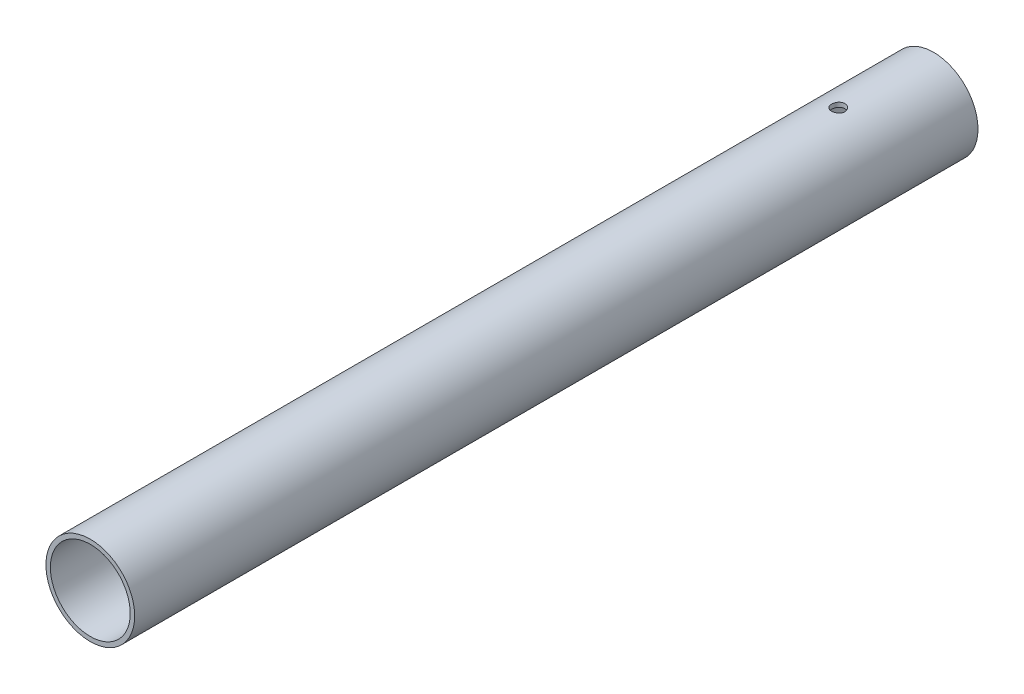
ISO-10303-21;
HEADER;
FILE_DESCRIPTION(('STEP AP214'),'2;1');
FILE_NAME('part.step','',(''),(''),'','','');
FILE_SCHEMA(('AUTOMOTIVE_DESIGN { 1 0 10303 214 1 1 1 1 }'));
ENDSEC;
DATA;
#1=APPLICATION_CONTEXT('core data for automotive mechanical design processes');
#2=APPLICATION_PROTOCOL_DEFINITION('international standard','automotive_design',2000,#1);
#3=PRODUCT_CONTEXT('',#1,'mechanical');
#4=PRODUCT('Part','Part','',(#3));
#5=PRODUCT_RELATED_PRODUCT_CATEGORY('part','',(#4));
#6=PRODUCT_DEFINITION_FORMATION('','',#4);
#7=PRODUCT_DEFINITION_CONTEXT('part definition',#1,'design');
#8=PRODUCT_DEFINITION('design','',#6,#7);
#9=PRODUCT_DEFINITION_SHAPE('','',#8);
#10=(LENGTH_UNIT() NAMED_UNIT(*) SI_UNIT(.MILLI.,.METRE.));
#11=(NAMED_UNIT(*) PLANE_ANGLE_UNIT() SI_UNIT($,.RADIAN.));
#12=(NAMED_UNIT(*) SI_UNIT($,.STERADIAN.) SOLID_ANGLE_UNIT());
#13=UNCERTAINTY_MEASURE_WITH_UNIT(LENGTH_MEASURE(1.E-05),#10,'distance_accuracy_value','');
#14=(GEOMETRIC_REPRESENTATION_CONTEXT(3) GLOBAL_UNCERTAINTY_ASSIGNED_CONTEXT((#13)) GLOBAL_UNIT_ASSIGNED_CONTEXT((#10,
#11,#12)) REPRESENTATION_CONTEXT('',''));
#15=CARTESIAN_POINT('',(0.,0.,0.));
#16=DIRECTION('',(0.,0.,1.));
#17=DIRECTION('',(1.,0.,0.));
#18=AXIS2_PLACEMENT_3D('',#15,#16,#17);
#19=CARTESIAN_POINT('',(0.,0.,190.));
#20=DIRECTION('',(0.,0.,1.));
#21=DIRECTION('',(1.,0.,0.));
#22=AXIS2_PLACEMENT_3D('',#19,#20,#21);
#23=PLANE('',#22);
#24=CARTESIAN_POINT('',(0.,0.,190.));
#25=DIRECTION('',(0.,0.,1.));
#26=DIRECTION('',(1.,0.,0.));
#27=AXIS2_PLACEMENT_3D('',#24,#25,#26);
#28=CIRCLE('',#27,10.);
#29=CARTESIAN_POINT('',(10.,0.,190.));
#30=VERTEX_POINT('',#29);
#31=EDGE_CURVE('E10',#30,#30,#28,.T.);
#32=ORIENTED_EDGE('',*,*,#31,.T.);
#33=EDGE_LOOP('',(#32));
#34=FACE_BOUND('',#33,.T.);
#35=CARTESIAN_POINT('',(0.,0.,190.));
#36=DIRECTION('',(0.,0.,1.));
#37=DIRECTION('',(1.,0.,0.));
#38=AXIS2_PLACEMENT_3D('',#35,#36,#37);
#39=CIRCLE('',#38,9.);
#40=CARTESIAN_POINT('',(9.,0.,190.));
#41=VERTEX_POINT('',#40);
#42=EDGE_CURVE('E61',#41,#41,#39,.T.);
#43=ORIENTED_EDGE('',*,*,#42,.F.);
#44=EDGE_LOOP('',(#43));
#45=FACE_BOUND('',#44,.T.);
#46=ADVANCED_FACE('F43',(#34,#45),#23,.T.);
#47=CARTESIAN_POINT('',(0.,0.,0.));
#48=DIRECTION('',(0.,0.,1.));
#49=DIRECTION('',(1.,0.,0.));
#50=AXIS2_PLACEMENT_3D('',#47,#48,#49);
#51=PLANE('',#50);
#52=CARTESIAN_POINT('',(0.,0.,0.));
#53=DIRECTION('',(0.,0.,1.));
#54=DIRECTION('',(1.,0.,0.));
#55=AXIS2_PLACEMENT_3D('',#52,#53,#54);
#56=CIRCLE('',#55,10.);
#57=CARTESIAN_POINT('',(10.,0.,0.));
#58=VERTEX_POINT('',#57);
#59=EDGE_CURVE('E59',#58,#58,#56,.T.);
#60=ORIENTED_EDGE('',*,*,#59,.F.);
#61=EDGE_LOOP('',(#60));
#62=FACE_BOUND('',#61,.T.);
#63=CARTESIAN_POINT('',(0.,0.,0.));
#64=DIRECTION('',(0.,0.,1.));
#65=DIRECTION('',(1.,0.,0.));
#66=AXIS2_PLACEMENT_3D('',#63,#64,#65);
#67=CIRCLE('',#66,9.);
#68=CARTESIAN_POINT('',(9.,0.,0.));
#69=VERTEX_POINT('',#68);
#70=EDGE_CURVE('E70',#69,#69,#67,.T.);
#71=ORIENTED_EDGE('',*,*,#70,.T.);
#72=EDGE_LOOP('',(#71));
#73=FACE_BOUND('',#72,.T.);
#74=ADVANCED_FACE('F107',(#62,#73),#51,.F.);
#75=CARTESIAN_POINT('',(0.,0.,190.));
#76=DIRECTION('',(0.,0.,-1.));
#77=DIRECTION('',(-1.,0.,0.));
#78=AXIS2_PLACEMENT_3D('',#75,#76,#77);
#79=CYLINDRICAL_SURFACE('',#78,10.);
#80=CARTESIAN_POINT('',(0.,-10.,23.));
#81=CARTESIAN_POINT('',(0.0837515444816423,-9.99999865771297,22.9999965461848));
#82=CARTESIAN_POINT('',(0.167551685082132,-9.9989368253704,22.9929619991594));
#83=CARTESIAN_POINT('',(0.332809627994914,-9.99480315973187,22.9650168000172));
#84=CARTESIAN_POINT('',(0.414265068974229,-9.99172936938473,22.9440926370551));
#85=CARTESIAN_POINT('',(0.572418086221861,-9.98391721219526,22.8890074950324));
#86=CARTESIAN_POINT('',(0.649119207826801,-9.97918010370919,22.854856520494));
#87=CARTESIAN_POINT('',(0.795690428635256,-9.96856475911724,22.7743116205831));
#88=CARTESIAN_POINT('',(0.865561474725191,-9.96268668152773,22.7279193955826));
#89=CARTESIAN_POINT('',(0.997046719562128,-9.95039170991452,22.6238227350601));
#90=CARTESIAN_POINT('',(1.0585998322255,-9.94397133890331,22.5660415437918));
#91=CARTESIAN_POINT('',(1.17117490668949,-9.93134261133238,22.4409723111061));
#92=CARTESIAN_POINT('',(1.22219626272936,-9.92513426698505,22.3736837232215));
#93=CARTESIAN_POINT('',(1.31249729499943,-9.91359877458726,22.2310993564775));
#94=CARTESIAN_POINT('',(1.35171787037205,-9.90827611975031,22.1557657530187));
#95=CARTESIAN_POINT('',(1.41692632171056,-9.89916211306268,21.9994871793546));
#96=CARTESIAN_POINT('',(1.44291491889163,-9.89537067775448,21.9185425152561));
#97=CARTESIAN_POINT('',(1.48073198798911,-9.88978256218673,21.7539819581283));
#98=CARTESIAN_POINT('',(1.49266503640518,-9.8879711574125,21.670390606592));
#99=CARTESIAN_POINT('',(1.50235624033932,-9.88650348970582,21.5023738340127));
#100=CARTESIAN_POINT('',(1.50011520973796,-9.88684710303147,21.4179484611375));
#101=CARTESIAN_POINT('',(1.48160733250788,-9.88963718352409,21.2513989198059));
#102=CARTESIAN_POINT('',(1.4654569592775,-9.89206618761549,21.1692614735152));
#103=CARTESIAN_POINT('',(1.41977117403734,-9.89872608126367,21.0088756311285));
#104=CARTESIAN_POINT('',(1.39023538337812,-9.90295702179379,20.9306273451193));
#105=CARTESIAN_POINT('',(1.31849603529737,-9.91276335545481,20.7798866287171));
#106=CARTESIAN_POINT('',(1.27624314283198,-9.91834396766526,20.7074180309076));
#107=CARTESIAN_POINT('',(1.18030413128955,-9.93021707574548,20.5705554042181));
#108=CARTESIAN_POINT('',(1.12661726182478,-9.93650961832501,20.5061619057306));
#109=CARTESIAN_POINT('',(1.00869493078248,-9.94917473056209,20.3866023392603));
#110=CARTESIAN_POINT('',(0.944359329642002,-9.95554747112815,20.3315350097137));
#111=CARTESIAN_POINT('',(0.807307089894187,-9.96759647648462,20.2329640654927));
#112=CARTESIAN_POINT('',(0.734590414588172,-9.9732727382251,20.1894605014561));
#113=CARTESIAN_POINT('',(0.582754598213688,-9.98329515585393,20.1152469135004));
#114=CARTESIAN_POINT('',(0.50363167783678,-9.98764051925428,20.0845445081597));
#115=CARTESIAN_POINT('',(0.341273182487059,-9.99450490557069,20.0368906103146));
#116=CARTESIAN_POINT('',(0.258037885952599,-9.99702405195467,20.0199381881844));
#117=CARTESIAN_POINT('',(0.0906695676436445,-9.99993581133871,20.0003967701833));
#118=CARTESIAN_POINT('',(0.0065527318704684,-10.0003485209039,19.9976720286207));
#119=CARTESIAN_POINT('',(-0.160936677662284,-9.99905561015226,20.006303005311));
#120=CARTESIAN_POINT('',(-0.244309274381878,-9.99735005541369,20.0176582876681));
#121=CARTESIAN_POINT('',(-0.407532387431409,-9.99202468615333,20.0540141001775));
#122=CARTESIAN_POINT('',(-0.48739796307984,-9.98841415207984,20.0789484960308));
#123=CARTESIAN_POINT('',(-0.641814958643001,-9.97968235658369,20.1416849974618));
#124=CARTESIAN_POINT('',(-0.716366128795101,-9.97456102421565,20.1794877073336));
#125=CARTESIAN_POINT('',(-0.858634979291923,-9.96332682468686,20.2672062245639));
#126=CARTESIAN_POINT('',(-0.926299009891569,-9.95720701626745,20.3172081400128));
#127=CARTESIAN_POINT('',(-1.05232367317771,-9.94467863012165,20.4277858116287));
#128=CARTESIAN_POINT('',(-1.11068376479341,-9.93827003562867,20.4883621823246));
#129=CARTESIAN_POINT('',(-1.21693784957196,-9.92582264304494,20.6189735331765));
#130=CARTESIAN_POINT('',(-1.26474084747422,-9.91978736017588,20.6890829251948));
#131=CARTESIAN_POINT('',(-1.34789129270584,-9.90883219104903,20.8364160405118));
#132=CARTESIAN_POINT('',(-1.38323907656436,-9.90391227465628,20.9136395715215));
#133=CARTESIAN_POINT('',(-1.44033467323944,-9.89577033008645,21.0727375336231));
#134=CARTESIAN_POINT('',(-1.46213037141636,-9.89254233006438,21.1545944609712));
#135=CARTESIAN_POINT('',(-1.49165549501587,-9.88813382297802,21.3208590154351));
#136=CARTESIAN_POINT('',(-1.49938589183067,-9.88695317451771,21.4052664659947));
#137=CARTESIAN_POINT('',(-1.5005378666944,-9.88677832610841,21.5733290633158));
#138=CARTESIAN_POINT('',(-1.49410252167313,-9.88776226333502,21.6569832417569));
#139=CARTESIAN_POINT('',(-1.46741229544379,-9.89175820611174,21.8220052633235));
#140=CARTESIAN_POINT('',(-1.44715743638627,-9.89477020841118,21.9033731101134));
#141=CARTESIAN_POINT('',(-1.39345373518665,-9.90247526112297,22.0614730822343));
#142=CARTESIAN_POINT('',(-1.36001489324314,-9.90716703716075,22.1382086704334));
#143=CARTESIAN_POINT('',(-1.28090667642309,-9.91770454557702,22.2850036338024));
#144=CARTESIAN_POINT('',(-1.23523688741502,-9.92355031702724,22.3550627828036));
#145=CARTESIAN_POINT('',(-1.13244337659164,-9.93580743364938,22.4872430579752));
#146=CARTESIAN_POINT('',(-1.07521369039806,-9.94222367881967,22.5492813332471));
#147=CARTESIAN_POINT('',(-0.951148841082834,-9.95485788826636,22.6629245547878));
#148=CARTESIAN_POINT('',(-0.884311448350941,-9.96107580610759,22.7145270725762));
#149=CARTESIAN_POINT('',(-0.742495707543722,-9.9726518579052,22.8060876766074));
#150=CARTESIAN_POINT('',(-0.667474576764761,-9.9780050712882,22.8459801092147));
#151=CARTESIAN_POINT('',(-0.51175187024872,-9.98720028802959,22.912538516758));
#152=CARTESIAN_POINT('',(-0.431056277096705,-9.99104385565757,22.9392181900537));
#153=CARTESIAN_POINT('',(-0.29166572788933,-9.99590939261505,22.9725413427101));
#154=CARTESIAN_POINT('',(-0.233831133495279,-9.99743549179557,22.9828226015388));
#155=CARTESIAN_POINT('',(-0.117338971600126,-9.99948125947896,22.9965530977126));
#156=CARTESIAN_POINT('',(-0.0586814143344176,-10.0000009404877,23.0000024199525));
#157=CARTESIAN_POINT('',(0.,-10.,23.));
#158=B_SPLINE_CURVE_WITH_KNOTS('',3,(#80,#81,#82,#83,#84,#85,#86,#87,#88,#89,#90,#91,#92,#93,
#94,#95,#96,#97,#98,#99,#100,#101,#102,#103,#104,#105,#106,#107,#108,#109,#110,#111,#112,#113,
#114,#115,#116,#117,#118,#119,#120,#121,#122,#123,#124,#125,#126,#127,#128,#129,#130,#131,#132,
#133,#134,#135,#136,#137,#138,#139,#140,#141,#142,#143,#144,#145,#146,#147,#148,#149,#150,#151,
#152,#153,#154,#155,#156,#157),.UNSPECIFIED.,.T.,.F.,(4,2,2,2,2,2,2,2,2,2,2,2,2,2,2,2,2,2,2,2,2,
2,2,2,2,2,2,2,2,2,2,2,2,2,2,2,2,2,4),(0.,0.251040205031664,0.502324962929151,0.753420023583239,
1.0044802241976,1.25729416136843,1.5101226357258,1.76419702395375,2.01825756225506,
2.27041564605924,2.52255925098983,2.77261177195746,3.02267136690361,3.27371383476159,
3.52477278308535,3.77834291255409,4.03191415238668,4.28563608984875,4.53934087193402,
4.79062058544256,5.04189251991156,5.29195148965949,5.54202220376274,5.79391188036908,
6.0458162002863,6.29981366584673,6.55380426808833,6.80689223457169,7.05996272137178,
7.31048888261065,7.56101464229565,7.81135073984148,8.06169531466881,8.31444829965722,
8.56726003468734,8.82146323384734,9.07540233261442,9.25129851978809,9.42719252123292),.UNSPECIFIED.);
#159=CARTESIAN_POINT('',(0.,-10.,23.));
#160=VERTEX_POINT('',#159);
#161=EDGE_CURVE('E94',#160,#160,#158,.T.);
#162=ORIENTED_EDGE('',*,*,#161,.T.);
#163=EDGE_LOOP('',(#162));
#164=FACE_BOUND('',#163,.T.);
#165=CARTESIAN_POINT('',(0.,10.,23.));
#166=CARTESIAN_POINT('',(-0.0837515444816423,9.99999865771297,22.9999965461848));
#167=CARTESIAN_POINT('',(-0.167551685082132,9.9989368253704,22.9929619991594));
#168=CARTESIAN_POINT('',(-0.332809627994914,9.99480315973187,22.9650168000172));
#169=CARTESIAN_POINT('',(-0.414265068974229,9.99172936938473,22.9440926370551));
#170=CARTESIAN_POINT('',(-0.572418086221861,9.98391721219526,22.8890074950324));
#171=CARTESIAN_POINT('',(-0.649119207826801,9.97918010370919,22.854856520494));
#172=CARTESIAN_POINT('',(-0.795690428635256,9.96856475911724,22.7743116205831));
#173=CARTESIAN_POINT('',(-0.865561474725191,9.96268668152773,22.7279193955826));
#174=CARTESIAN_POINT('',(-0.997046719562128,9.95039170991452,22.6238227350601));
#175=CARTESIAN_POINT('',(-1.0585998322255,9.94397133890331,22.5660415437918));
#176=CARTESIAN_POINT('',(-1.17117490668949,9.93134261133238,22.4409723111061));
#177=CARTESIAN_POINT('',(-1.22219626272936,9.92513426698505,22.3736837232215));
#178=CARTESIAN_POINT('',(-1.31249729499943,9.91359877458726,22.2310993564775));
#179=CARTESIAN_POINT('',(-1.35171787037205,9.90827611975031,22.1557657530187));
#180=CARTESIAN_POINT('',(-1.41692632171056,9.89916211306268,21.9994871793546));
#181=CARTESIAN_POINT('',(-1.44291491889163,9.89537067775448,21.9185425152561));
#182=CARTESIAN_POINT('',(-1.48073198798911,9.88978256218673,21.7539819581283));
#183=CARTESIAN_POINT('',(-1.49266503640518,9.8879711574125,21.670390606592));
#184=CARTESIAN_POINT('',(-1.50235624033932,9.88650348970582,21.5023738340127));
#185=CARTESIAN_POINT('',(-1.50011520973796,9.88684710303147,21.4179484611375));
#186=CARTESIAN_POINT('',(-1.48160733250788,9.88963718352409,21.2513989198059));
#187=CARTESIAN_POINT('',(-1.4654569592775,9.89206618761549,21.1692614735152));
#188=CARTESIAN_POINT('',(-1.41977117403734,9.89872608126367,21.0088756311285));
#189=CARTESIAN_POINT('',(-1.39023538337812,9.90295702179379,20.9306273451193));
#190=CARTESIAN_POINT('',(-1.31849603529737,9.91276335545481,20.7798866287171));
#191=CARTESIAN_POINT('',(-1.27624314283198,9.91834396766526,20.7074180309076));
#192=CARTESIAN_POINT('',(-1.18030413128955,9.93021707574548,20.5705554042181));
#193=CARTESIAN_POINT('',(-1.12661726182478,9.93650961832501,20.5061619057306));
#194=CARTESIAN_POINT('',(-1.00869493078248,9.94917473056209,20.3866023392603));
#195=CARTESIAN_POINT('',(-0.944359329642002,9.95554747112815,20.3315350097137));
#196=CARTESIAN_POINT('',(-0.807307089894187,9.96759647648462,20.2329640654927));
#197=CARTESIAN_POINT('',(-0.734590414588172,9.9732727382251,20.1894605014561));
#198=CARTESIAN_POINT('',(-0.582754598213688,9.98329515585393,20.1152469135004));
#199=CARTESIAN_POINT('',(-0.50363167783678,9.98764051925428,20.0845445081597));
#200=CARTESIAN_POINT('',(-0.341273182487059,9.99450490557069,20.0368906103146));
#201=CARTESIAN_POINT('',(-0.258037885952599,9.99702405195467,20.0199381881844));
#202=CARTESIAN_POINT('',(-0.0906695676436445,9.99993581133871,20.0003967701833));
#203=CARTESIAN_POINT('',(-0.0065527318704684,10.0003485209039,19.9976720286207));
#204=CARTESIAN_POINT('',(0.160936677662284,9.99905561015226,20.006303005311));
#205=CARTESIAN_POINT('',(0.244309274381878,9.99735005541369,20.0176582876681));
#206=CARTESIAN_POINT('',(0.407532387431409,9.99202468615333,20.0540141001775));
#207=CARTESIAN_POINT('',(0.48739796307984,9.98841415207984,20.0789484960308));
#208=CARTESIAN_POINT('',(0.641814958643001,9.97968235658369,20.1416849974618));
#209=CARTESIAN_POINT('',(0.716366128795101,9.97456102421565,20.1794877073336));
#210=CARTESIAN_POINT('',(0.858634979291923,9.96332682468686,20.2672062245639));
#211=CARTESIAN_POINT('',(0.926299009891569,9.95720701626745,20.3172081400128));
#212=CARTESIAN_POINT('',(1.05232367317771,9.94467863012165,20.4277858116287));
#213=CARTESIAN_POINT('',(1.11068376479341,9.93827003562867,20.4883621823246));
#214=CARTESIAN_POINT('',(1.21693784957196,9.92582264304494,20.6189735331765));
#215=CARTESIAN_POINT('',(1.26474084747422,9.91978736017588,20.6890829251948));
#216=CARTESIAN_POINT('',(1.34789129270584,9.90883219104903,20.8364160405118));
#217=CARTESIAN_POINT('',(1.38323907656436,9.90391227465628,20.9136395715215));
#218=CARTESIAN_POINT('',(1.44033467323944,9.89577033008645,21.0727375336231));
#219=CARTESIAN_POINT('',(1.46213037141636,9.89254233006438,21.1545944609712));
#220=CARTESIAN_POINT('',(1.49165549501587,9.88813382297802,21.3208590154351));
#221=CARTESIAN_POINT('',(1.49938589183067,9.88695317451771,21.4052664659947));
#222=CARTESIAN_POINT('',(1.5005378666944,9.88677832610841,21.5733290633158));
#223=CARTESIAN_POINT('',(1.49410252167313,9.88776226333502,21.6569832417569));
#224=CARTESIAN_POINT('',(1.46741229544379,9.89175820611174,21.8220052633235));
#225=CARTESIAN_POINT('',(1.44715743638627,9.89477020841118,21.9033731101134));
#226=CARTESIAN_POINT('',(1.39345373518665,9.90247526112297,22.0614730822343));
#227=CARTESIAN_POINT('',(1.36001489324314,9.90716703716075,22.1382086704334));
#228=CARTESIAN_POINT('',(1.28090667642309,9.91770454557702,22.2850036338024));
#229=CARTESIAN_POINT('',(1.23523688741502,9.92355031702724,22.3550627828036));
#230=CARTESIAN_POINT('',(1.13244337659164,9.93580743364938,22.4872430579752));
#231=CARTESIAN_POINT('',(1.07521369039806,9.94222367881967,22.5492813332471));
#232=CARTESIAN_POINT('',(0.951148841082834,9.95485788826636,22.6629245547878));
#233=CARTESIAN_POINT('',(0.884311448350941,9.96107580610759,22.7145270725762));
#234=CARTESIAN_POINT('',(0.742495707543722,9.9726518579052,22.8060876766074));
#235=CARTESIAN_POINT('',(0.667474576764761,9.9780050712882,22.8459801092147));
#236=CARTESIAN_POINT('',(0.51175187024872,9.98720028802959,22.912538516758));
#237=CARTESIAN_POINT('',(0.431056277096705,9.99104385565757,22.9392181900537));
#238=CARTESIAN_POINT('',(0.29166572788933,9.99590939261505,22.9725413427101));
#239=CARTESIAN_POINT('',(0.233831133495279,9.99743549179557,22.9828226015388));
#240=CARTESIAN_POINT('',(0.117338971600126,9.99948125947896,22.9965530977126));
#241=CARTESIAN_POINT('',(0.0586814143344176,10.0000009404877,23.0000024199525));
#242=CARTESIAN_POINT('',(0.,10.,23.));
#243=B_SPLINE_CURVE_WITH_KNOTS('',3,(#165,#166,#167,#168,#169,#170,#171,#172,#173,#174,#175,
#176,#177,#178,#179,#180,#181,#182,#183,#184,#185,#186,#187,#188,#189,#190,#191,#192,#193,#194,
#195,#196,#197,#198,#199,#200,#201,#202,#203,#204,#205,#206,#207,#208,#209,#210,#211,#212,#213,
#214,#215,#216,#217,#218,#219,#220,#221,#222,#223,#224,#225,#226,#227,#228,#229,#230,#231,#232,
#233,#234,#235,#236,#237,#238,#239,#240,#241,#242),.UNSPECIFIED.,.T.,.F.,(4,2,2,2,2,2,2,2,2,2,2,
2,2,2,2,2,2,2,2,2,2,2,2,2,2,2,2,2,2,2,2,2,2,2,2,2,2,2,4),(0.,0.251040205031664,
0.502324962929151,0.753420023583239,1.0044802241976,1.25729416136843,1.5101226357258,
1.76419702395375,2.01825756225506,2.27041564605924,2.52255925098983,2.77261177195746,
3.02267136690361,3.27371383476159,3.52477278308535,3.77834291255409,4.03191415238668,
4.28563608984875,4.53934087193402,4.79062058544256,5.04189251991156,5.29195148965949,
5.54202220376274,5.79391188036908,6.0458162002863,6.29981366584673,6.55380426808833,
6.80689223457169,7.05996272137178,7.31048888261065,7.56101464229565,7.81135073984148,
8.06169531466881,8.31444829965722,8.56726003468734,8.82146323384734,9.07540233261442,
9.25129851978809,9.42719252123292),.UNSPECIFIED.);
#244=CARTESIAN_POINT('',(0.,10.,23.));
#245=VERTEX_POINT('',#244);
#246=EDGE_CURVE('E86',#245,#245,#243,.T.);
#247=ORIENTED_EDGE('',*,*,#246,.T.);
#248=EDGE_LOOP('',(#247));
#249=FACE_BOUND('',#248,.T.);
#250=ORIENTED_EDGE('',*,*,#31,.F.);
#251=EDGE_LOOP('',(#250));
#252=FACE_BOUND('',#251,.T.);
#253=ORIENTED_EDGE('',*,*,#59,.T.);
#254=EDGE_LOOP('',(#253));
#255=FACE_BOUND('',#254,.T.);
#256=ADVANCED_FACE('F44',(#164,#249,#252,#255),#79,.T.);
#257=CARTESIAN_POINT('',(0.,0.,190.));
#258=DIRECTION('',(0.,0.,-1.));
#259=DIRECTION('',(-1.,0.,0.));
#260=AXIS2_PLACEMENT_3D('',#257,#258,#259);
#261=CYLINDRICAL_SURFACE('',#260,9.);
#262=CARTESIAN_POINT('',(0.,-9.,23.));
#263=CARTESIAN_POINT('',(0.0836345429749291,-8.99999856701294,22.9999966466313));
#264=CARTESIAN_POINT('',(0.167314729103293,-8.9988220674782,22.9929816350186));
#265=CARTESIAN_POINT('',(0.332328133003826,-8.99424206964832,22.9651186047408));
#266=CARTESIAN_POINT('',(0.413659120775549,-8.99083652354334,22.944257865853));
#267=CARTESIAN_POINT('',(0.571562848327587,-8.9821804094187,22.8893507308443));
#268=CARTESIAN_POINT('',(0.648139421059142,-8.97693135095516,22.8553151206157));
#269=CARTESIAN_POINT('',(0.794485105186769,-8.96516536249242,22.7750526247686));
#270=CARTESIAN_POINT('',(0.864254993927157,-8.9586485775266,22.7288271335102));
#271=CARTESIAN_POINT('',(0.99568356857501,-8.94499990474988,22.6250269497077));
#272=CARTESIAN_POINT('',(1.05726774212098,-8.93786323088914,22.5673585312183));
#273=CARTESIAN_POINT('',(1.16993309919596,-8.92381576126039,22.4425112189163));
#274=CARTESIAN_POINT('',(1.22101361963459,-8.916904979776,22.375331725126));
#275=CARTESIAN_POINT('',(1.31152027536308,-8.90404539455868,22.2328574202818));
#276=CARTESIAN_POINT('',(1.3508727317166,-8.89810277454982,22.1575151979171));
#277=CARTESIAN_POINT('',(1.41633501924673,-8.88791873876805,22.0011742614196));
#278=CARTESIAN_POINT('',(1.44244574493937,-8.88367720808584,21.9201759297934));
#279=CARTESIAN_POINT('',(1.48044862667089,-8.87742322105653,21.7556118350861));
#280=CARTESIAN_POINT('',(1.49246941748124,-8.8753906109142,21.6720765580992));
#281=CARTESIAN_POINT('',(1.50235003517393,-8.87372363361989,21.5041518338699));
#282=CARTESIAN_POINT('',(1.5002108642334,-8.87408909674328,21.4197624474996));
#283=CARTESIAN_POINT('',(1.48193705903769,-8.87715857318133,21.2534432832347));
#284=CARTESIAN_POINT('',(1.46594692913386,-8.8798384399135,21.1714971178729));
#285=CARTESIAN_POINT('',(1.42065188424207,-8.88719697126605,21.0114672093025));
#286=CARTESIAN_POINT('',(1.39134651259185,-8.89187570443963,20.9333835986669));
#287=CARTESIAN_POINT('',(1.32010634765635,-8.9027308760046,20.7828627059354));
#288=CARTESIAN_POINT('',(1.27811154832783,-8.90891440264395,20.7104543563513));
#289=CARTESIAN_POINT('',(1.18272721053446,-8.92207751049005,20.573657359677));
#290=CARTESIAN_POINT('',(1.12933675239257,-8.92905715592572,20.509269360527));
#291=CARTESIAN_POINT('',(1.01188932729543,-8.94313216727871,20.3895043485156));
#292=CARTESIAN_POINT('',(0.947708378323879,-8.95022789538991,20.3342488888759));
#293=CARTESIAN_POINT('',(0.810921149388989,-8.96365560838034,20.2352733424008));
#294=CARTESIAN_POINT('',(0.738314815143854,-8.96998758833847,20.1915533298901));
#295=CARTESIAN_POINT('',(0.586623549700026,-8.98118335735747,20.1168786637182));
#296=CARTESIAN_POINT('',(0.507533235338796,-8.98604591044468,20.0859347484012));
#297=CARTESIAN_POINT('',(0.345179007361638,-8.99374501807596,20.0378034708524));
#298=CARTESIAN_POINT('',(0.26191544350768,-8.99658174210284,20.0206149578158));
#299=CARTESIAN_POINT('',(0.0946259407809729,-8.99988677905612,20.0006471849233));
#300=CARTESIAN_POINT('',(0.0106204422906054,-9.00038251807671,19.9977010569166));
#301=CARTESIAN_POINT('',(-0.156683863733934,-8.99902484652702,20.0058568066569));
#302=CARTESIAN_POINT('',(-0.239982698335225,-8.99717152634471,20.0169581438802));
#303=CARTESIAN_POINT('',(-0.40299370532806,-8.99134096162921,20.0527549096013));
#304=CARTESIAN_POINT('',(-0.482724521031229,-8.98737662880787,20.0773677250341));
#305=CARTESIAN_POINT('',(-0.636928130916267,-8.97776678673215,20.1394007109197));
#306=CARTESIAN_POINT('',(-0.711400629545833,-8.97212118307212,20.1768216005812));
#307=CARTESIAN_POINT('',(-0.853698413681377,-8.95970709781444,20.2637906748181));
#308=CARTESIAN_POINT('',(-0.92145915056229,-8.95292913532213,20.3134430937004));
#309=CARTESIAN_POINT('',(-1.04774615130161,-8.93903080435141,20.423322389231));
#310=CARTESIAN_POINT('',(-1.10627174381795,-8.93191041102928,20.483550033966));
#311=CARTESIAN_POINT('',(-1.2130456677948,-8.91804105141507,20.6136185288429));
#312=CARTESIAN_POINT('',(-1.26118125666823,-8.91129669682263,20.6835524993086));
#313=CARTESIAN_POINT('',(-1.34502138617699,-8.8990291786673,20.8306117814831));
#314=CARTESIAN_POINT('',(-1.38072632086189,-8.89350597639612,20.9077368651365));
#315=CARTESIAN_POINT('',(-1.43852299888389,-8.88434072218623,21.0666738396873));
#316=CARTESIAN_POINT('',(-1.46067085952877,-8.88069092586639,21.1484648570183));
#317=CARTESIAN_POINT('',(-1.49090127226697,-8.87566630101156,21.3146720775331));
#318=CARTESIAN_POINT('',(-1.4989850471677,-8.87429127469633,21.3990880518392));
#319=CARTESIAN_POINT('',(-1.50082371962841,-8.87398039850407,21.5670230995774));
#320=CARTESIAN_POINT('',(-1.49475608167511,-8.8750143390339,21.6505402271452));
#321=CARTESIAN_POINT('',(-1.46884790337411,-8.87933868872237,21.8153475488305));
#322=CARTESIAN_POINT('',(-1.44900740766749,-8.88262909056728,21.8966377501651));
#323=CARTESIAN_POINT('',(-1.39618469375694,-8.89108413769031,22.0546150623756));
#324=CARTESIAN_POINT('',(-1.36321775436027,-8.89624660331802,22.1313074060336));
#325=CARTESIAN_POINT('',(-1.28509620234955,-8.90786621353324,22.2781014015169));
#326=CARTESIAN_POINT('',(-1.23994098524914,-8.91432342233039,22.3482027262233));
#327=CARTESIAN_POINT('',(-1.13809133062329,-8.92790072427373,22.4807213498647));
#328=CARTESIAN_POINT('',(-1.08126633815619,-8.93502777345781,22.5430376100202));
#329=CARTESIAN_POINT('',(-0.957965418828138,-8.94908623416505,22.657310962685));
#330=CARTESIAN_POINT('',(-0.891487267747582,-8.95601760015928,22.7092656611829));
#331=CARTESIAN_POINT('',(-0.750221501784169,-8.96895917785332,22.80166896092));
#332=CARTESIAN_POINT('',(-0.675379672519691,-8.97496269751862,22.8420356235878));
#333=CARTESIAN_POINT('',(-0.519907841627389,-8.98530700561065,22.909561690766));
#334=CARTESIAN_POINT('',(-0.439283696898006,-8.98964944906489,22.9367342486478));
#335=CARTESIAN_POINT('',(-0.29862198602724,-8.99523474499773,22.971203164476));
#336=CARTESIAN_POINT('',(-0.239435298179068,-8.99701216364015,22.9819846817696));
#337=CARTESIAN_POINT('',(-0.120173586191885,-8.99939529591672,22.9963842427069));
#338=CARTESIAN_POINT('',(-0.0600985773650961,-9.00000102972385,23.0000024096824));
#339=CARTESIAN_POINT('',(0.,-9.,23.));
#340=B_SPLINE_CURVE_WITH_KNOTS('',3,(#262,#263,#264,#265,#266,#267,#268,#269,#270,#271,#272,
#273,#274,#275,#276,#277,#278,#279,#280,#281,#282,#283,#284,#285,#286,#287,#288,#289,#290,#291,
#292,#293,#294,#295,#296,#297,#298,#299,#300,#301,#302,#303,#304,#305,#306,#307,#308,#309,#310,
#311,#312,#313,#314,#315,#316,#317,#318,#319,#320,#321,#322,#323,#324,#325,#326,#327,#328,#329,
#330,#331,#332,#333,#334,#335,#336,#337,#338,#339),.UNSPECIFIED.,.T.,.F.,(4,2,2,2,2,2,2,2,2,2,2,
2,2,2,2,2,2,2,2,2,2,2,2,2,2,2,2,2,2,2,2,2,2,2,2,2,2,2,4),(0.,0.250683950963106,
0.501598527417254,0.752308120215164,1.00298904760488,1.255814946374,1.50865680101914,
1.76305512494304,2.01743626125709,2.26947646262055,2.52149882592532,2.77092313056245,
3.02035599015229,3.27098733979535,3.52163892408344,3.77539661946796,4.02915594981509,
4.28312813349542,4.5370790671269,4.78804730094839,5.03900587821517,5.2884468420385,
5.53790181495641,5.78956095376215,6.0412383783257,6.29552293204572,6.54979942425566,
6.80301613405065,7.05621082671972,7.30624745713621,7.55628327712881,7.80602890935735,
8.05578693017603,8.30850830516036,8.56128800327384,8.81581338964321,9.07008451278044,
9.25022548898412,9.43036336366182),.UNSPECIFIED.);
#341=CARTESIAN_POINT('',(0.,-9.,23.));
#342=VERTEX_POINT('',#341);
#343=EDGE_CURVE('E48',#342,#342,#340,.T.);
#344=ORIENTED_EDGE('',*,*,#343,.F.);
#345=EDGE_LOOP('',(#344));
#346=FACE_BOUND('',#345,.T.);
#347=CARTESIAN_POINT('',(0.,9.,23.));
#348=CARTESIAN_POINT('',(-0.0836345429749291,8.99999856701294,22.9999966466313));
#349=CARTESIAN_POINT('',(-0.167314729103293,8.9988220674782,22.9929816350186));
#350=CARTESIAN_POINT('',(-0.332328133003826,8.99424206964832,22.9651186047408));
#351=CARTESIAN_POINT('',(-0.413659120775549,8.99083652354334,22.944257865853));
#352=CARTESIAN_POINT('',(-0.571562848327587,8.9821804094187,22.8893507308443));
#353=CARTESIAN_POINT('',(-0.648139421059142,8.97693135095516,22.8553151206157));
#354=CARTESIAN_POINT('',(-0.794485105186769,8.96516536249242,22.7750526247686));
#355=CARTESIAN_POINT('',(-0.864254993927157,8.9586485775266,22.7288271335102));
#356=CARTESIAN_POINT('',(-0.99568356857501,8.94499990474988,22.6250269497077));
#357=CARTESIAN_POINT('',(-1.05726774212098,8.93786323088914,22.5673585312183));
#358=CARTESIAN_POINT('',(-1.16993309919596,8.92381576126039,22.4425112189163));
#359=CARTESIAN_POINT('',(-1.22101361963459,8.916904979776,22.375331725126));
#360=CARTESIAN_POINT('',(-1.31152027536308,8.90404539455868,22.2328574202818));
#361=CARTESIAN_POINT('',(-1.3508727317166,8.89810277454982,22.1575151979171));
#362=CARTESIAN_POINT('',(-1.41633501924673,8.88791873876805,22.0011742614196));
#363=CARTESIAN_POINT('',(-1.44244574493937,8.88367720808584,21.9201759297934));
#364=CARTESIAN_POINT('',(-1.48044862667089,8.87742322105653,21.7556118350861));
#365=CARTESIAN_POINT('',(-1.49246941748124,8.8753906109142,21.6720765580992));
#366=CARTESIAN_POINT('',(-1.50235003517393,8.87372363361989,21.5041518338699));
#367=CARTESIAN_POINT('',(-1.5002108642334,8.87408909674328,21.4197624474996));
#368=CARTESIAN_POINT('',(-1.48193705903769,8.87715857318133,21.2534432832347));
#369=CARTESIAN_POINT('',(-1.46594692913386,8.8798384399135,21.1714971178729));
#370=CARTESIAN_POINT('',(-1.42065188424207,8.88719697126605,21.0114672093025));
#371=CARTESIAN_POINT('',(-1.39134651259185,8.89187570443963,20.9333835986669));
#372=CARTESIAN_POINT('',(-1.32010634765635,8.9027308760046,20.7828627059354));
#373=CARTESIAN_POINT('',(-1.27811154832783,8.90891440264395,20.7104543563513));
#374=CARTESIAN_POINT('',(-1.18272721053446,8.92207751049005,20.573657359677));
#375=CARTESIAN_POINT('',(-1.12933675239257,8.92905715592572,20.509269360527));
#376=CARTESIAN_POINT('',(-1.01188932729543,8.94313216727871,20.3895043485156));
#377=CARTESIAN_POINT('',(-0.947708378323879,8.95022789538991,20.3342488888759));
#378=CARTESIAN_POINT('',(-0.810921149388989,8.96365560838034,20.2352733424008));
#379=CARTESIAN_POINT('',(-0.738314815143854,8.96998758833847,20.1915533298901));
#380=CARTESIAN_POINT('',(-0.586623549700026,8.98118335735747,20.1168786637182));
#381=CARTESIAN_POINT('',(-0.507533235338796,8.98604591044468,20.0859347484012));
#382=CARTESIAN_POINT('',(-0.345179007361638,8.99374501807596,20.0378034708524));
#383=CARTESIAN_POINT('',(-0.26191544350768,8.99658174210284,20.0206149578158));
#384=CARTESIAN_POINT('',(-0.0946259407809729,8.99988677905612,20.0006471849233));
#385=CARTESIAN_POINT('',(-0.0106204422906054,9.00038251807671,19.9977010569166));
#386=CARTESIAN_POINT('',(0.156683863733934,8.99902484652702,20.0058568066569));
#387=CARTESIAN_POINT('',(0.239982698335225,8.99717152634471,20.0169581438802));
#388=CARTESIAN_POINT('',(0.40299370532806,8.99134096162921,20.0527549096013));
#389=CARTESIAN_POINT('',(0.482724521031229,8.98737662880787,20.0773677250341));
#390=CARTESIAN_POINT('',(0.636928130916267,8.97776678673215,20.1394007109197));
#391=CARTESIAN_POINT('',(0.711400629545833,8.97212118307212,20.1768216005812));
#392=CARTESIAN_POINT('',(0.853698413681377,8.95970709781444,20.2637906748181));
#393=CARTESIAN_POINT('',(0.92145915056229,8.95292913532213,20.3134430937004));
#394=CARTESIAN_POINT('',(1.04774615130161,8.93903080435141,20.423322389231));
#395=CARTESIAN_POINT('',(1.10627174381795,8.93191041102928,20.483550033966));
#396=CARTESIAN_POINT('',(1.2130456677948,8.91804105141507,20.6136185288429));
#397=CARTESIAN_POINT('',(1.26118125666823,8.91129669682263,20.6835524993086));
#398=CARTESIAN_POINT('',(1.34502138617699,8.8990291786673,20.8306117814831));
#399=CARTESIAN_POINT('',(1.38072632086189,8.89350597639612,20.9077368651365));
#400=CARTESIAN_POINT('',(1.43852299888389,8.88434072218623,21.0666738396873));
#401=CARTESIAN_POINT('',(1.46067085952877,8.88069092586639,21.1484648570183));
#402=CARTESIAN_POINT('',(1.49090127226697,8.87566630101156,21.3146720775331));
#403=CARTESIAN_POINT('',(1.4989850471677,8.87429127469633,21.3990880518392));
#404=CARTESIAN_POINT('',(1.50082371962841,8.87398039850407,21.5670230995774));
#405=CARTESIAN_POINT('',(1.49475608167511,8.8750143390339,21.6505402271452));
#406=CARTESIAN_POINT('',(1.46884790337411,8.87933868872237,21.8153475488305));
#407=CARTESIAN_POINT('',(1.44900740766749,8.88262909056728,21.8966377501651));
#408=CARTESIAN_POINT('',(1.39618469375694,8.89108413769031,22.0546150623756));
#409=CARTESIAN_POINT('',(1.36321775436027,8.89624660331802,22.1313074060336));
#410=CARTESIAN_POINT('',(1.28509620234955,8.90786621353324,22.2781014015169));
#411=CARTESIAN_POINT('',(1.23994098524914,8.91432342233039,22.3482027262233));
#412=CARTESIAN_POINT('',(1.13809133062329,8.92790072427373,22.4807213498647));
#413=CARTESIAN_POINT('',(1.08126633815619,8.93502777345781,22.5430376100202));
#414=CARTESIAN_POINT('',(0.957965418828138,8.94908623416505,22.657310962685));
#415=CARTESIAN_POINT('',(0.891487267747582,8.95601760015928,22.7092656611829));
#416=CARTESIAN_POINT('',(0.750221501784169,8.96895917785332,22.80166896092));
#417=CARTESIAN_POINT('',(0.675379672519691,8.97496269751862,22.8420356235878));
#418=CARTESIAN_POINT('',(0.519907841627389,8.98530700561065,22.909561690766));
#419=CARTESIAN_POINT('',(0.439283696898006,8.98964944906489,22.9367342486478));
#420=CARTESIAN_POINT('',(0.29862198602724,8.99523474499773,22.971203164476));
#421=CARTESIAN_POINT('',(0.239435298179068,8.99701216364015,22.9819846817696));
#422=CARTESIAN_POINT('',(0.120173586191885,8.99939529591672,22.9963842427069));
#423=CARTESIAN_POINT('',(0.0600985773650961,9.00000102972385,23.0000024096824));
#424=CARTESIAN_POINT('',(0.,9.,23.));
#425=B_SPLINE_CURVE_WITH_KNOTS('',3,(#347,#348,#349,#350,#351,#352,#353,#354,#355,#356,#357,
#358,#359,#360,#361,#362,#363,#364,#365,#366,#367,#368,#369,#370,#371,#372,#373,#374,#375,#376,
#377,#378,#379,#380,#381,#382,#383,#384,#385,#386,#387,#388,#389,#390,#391,#392,#393,#394,#395,
#396,#397,#398,#399,#400,#401,#402,#403,#404,#405,#406,#407,#408,#409,#410,#411,#412,#413,#414,
#415,#416,#417,#418,#419,#420,#421,#422,#423,#424),.UNSPECIFIED.,.T.,.F.,(4,2,2,2,2,2,2,2,2,2,2,
2,2,2,2,2,2,2,2,2,2,2,2,2,2,2,2,2,2,2,2,2,2,2,2,2,2,2,4),(0.,0.250683950963106,
0.501598527417254,0.752308120215164,1.00298904760488,1.255814946374,1.50865680101914,
1.76305512494304,2.01743626125709,2.26947646262055,2.52149882592532,2.77092313056245,
3.02035599015229,3.27098733979535,3.52163892408344,3.77539661946796,4.02915594981509,
4.28312813349542,4.5370790671269,4.78804730094839,5.03900587821517,5.2884468420385,
5.53790181495641,5.78956095376215,6.0412383783257,6.29552293204572,6.54979942425566,
6.80301613405065,7.05621082671972,7.30624745713621,7.55628327712881,7.80602890935735,
8.05578693017603,8.30850830516036,8.56128800327384,8.81581338964321,9.07008451278044,
9.25022548898412,9.43036336366182),.UNSPECIFIED.);
#426=CARTESIAN_POINT('',(0.,9.,23.));
#427=VERTEX_POINT('',#426);
#428=EDGE_CURVE('E67',#427,#427,#425,.T.);
#429=ORIENTED_EDGE('',*,*,#428,.F.);
#430=EDGE_LOOP('',(#429));
#431=FACE_BOUND('',#430,.T.);
#432=ORIENTED_EDGE('',*,*,#42,.T.);
#433=EDGE_LOOP('',(#432));
#434=FACE_BOUND('',#433,.T.);
#435=ORIENTED_EDGE('',*,*,#70,.F.);
#436=EDGE_LOOP('',(#435));
#437=FACE_BOUND('',#436,.T.);
#438=ADVANCED_FACE('F73',(#346,#431,#434,#437),#261,.F.);
#439=CARTESIAN_POINT('',(0.,-10.,21.5));
#440=DIRECTION('',(0.,1.,0.));
#441=DIRECTION('',(0.,0.,1.));
#442=AXIS2_PLACEMENT_3D('',#439,#440,#441);
#443=CYLINDRICAL_SURFACE('',#442,1.5);
#444=ORIENTED_EDGE('',*,*,#428,.T.);
#445=EDGE_LOOP('',(#444));
#446=FACE_BOUND('',#445,.T.);
#447=ORIENTED_EDGE('',*,*,#246,.F.);
#448=EDGE_LOOP('',(#447));
#449=FACE_BOUND('',#448,.T.);
#450=ADVANCED_FACE('F83',(#446,#449),#443,.F.);
#451=ORIENTED_EDGE('',*,*,#343,.T.);
#452=EDGE_LOOP('',(#451));
#453=FACE_BOUND('',#452,.T.);
#454=ORIENTED_EDGE('',*,*,#161,.F.);
#455=EDGE_LOOP('',(#454));
#456=FACE_BOUND('',#455,.T.);
#457=ADVANCED_FACE('F79',(#453,#456),#443,.F.);
#458=CLOSED_SHELL('',(#46,#74,#256,#438,#450,#457));
#459=MANIFOLD_SOLID_BREP('B2',#458);
#460=ADVANCED_BREP_SHAPE_REPRESENTATION('',(#18,#459),#14);
#461=SHAPE_DEFINITION_REPRESENTATION(#9,#460);
ENDSEC;
END-ISO-10303-21;
